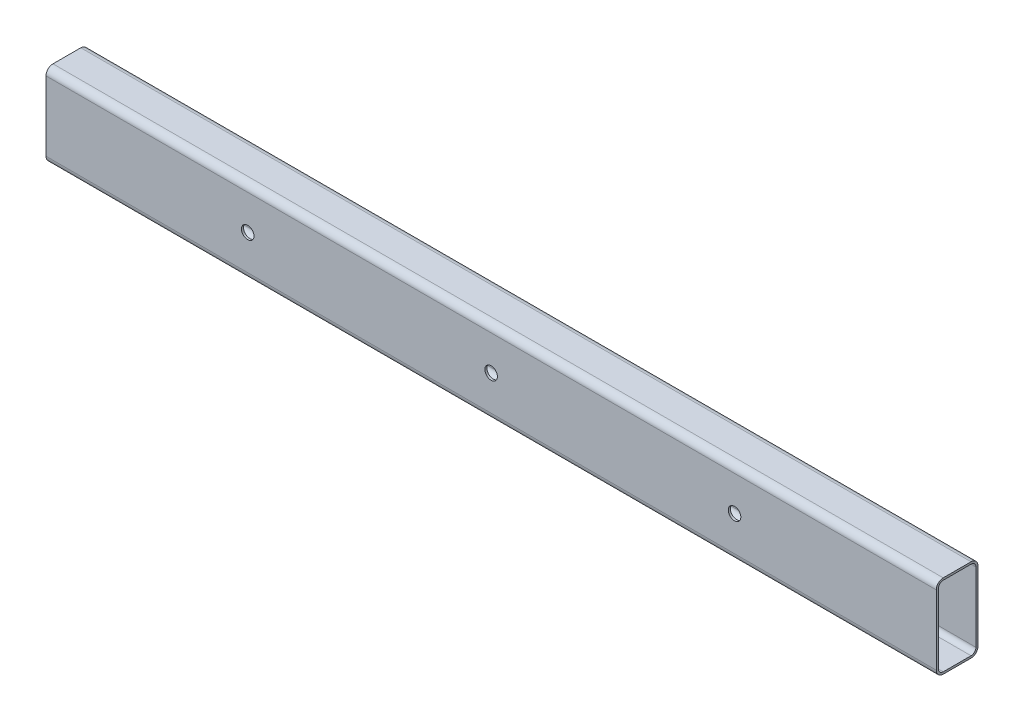
ISO-10303-21;
HEADER;
FILE_DESCRIPTION(('STEP AP214'),'2;1');
FILE_NAME('part.step','',(''),(''),'','','');
FILE_SCHEMA(('AUTOMOTIVE_DESIGN { 1 0 10303 214 1 1 1 1 }'));
ENDSEC;
DATA;
#1=APPLICATION_CONTEXT('core data for automotive mechanical design processes');
#2=APPLICATION_PROTOCOL_DEFINITION('international standard','automotive_design',2000,#1);
#3=PRODUCT_CONTEXT('',#1,'mechanical');
#4=PRODUCT('Part','Part','',(#3));
#5=PRODUCT_RELATED_PRODUCT_CATEGORY('part','',(#4));
#6=PRODUCT_DEFINITION_FORMATION('','',#4);
#7=PRODUCT_DEFINITION_CONTEXT('part definition',#1,'design');
#8=PRODUCT_DEFINITION('design','',#6,#7);
#9=PRODUCT_DEFINITION_SHAPE('','',#8);
#10=(LENGTH_UNIT() NAMED_UNIT(*) SI_UNIT(.MILLI.,.METRE.));
#11=(NAMED_UNIT(*) PLANE_ANGLE_UNIT() SI_UNIT($,.RADIAN.));
#12=(NAMED_UNIT(*) SI_UNIT($,.STERADIAN.) SOLID_ANGLE_UNIT());
#13=UNCERTAINTY_MEASURE_WITH_UNIT(LENGTH_MEASURE(1.E-05),#10,'distance_accuracy_value','');
#14=(GEOMETRIC_REPRESENTATION_CONTEXT(3) GLOBAL_UNCERTAINTY_ASSIGNED_CONTEXT((#13)) GLOBAL_UNIT_ASSIGNED_CONTEXT((#10,
#11,#12)) REPRESENTATION_CONTEXT('',''));
#15=CARTESIAN_POINT('',(0.,0.,0.));
#16=DIRECTION('',(0.,0.,1.));
#17=DIRECTION('',(1.,0.,0.));
#18=AXIS2_PLACEMENT_3D('',#15,#16,#17);
#19=CARTESIAN_POINT('',(-640.,-50.,20.));
#20=DIRECTION('',(1.,0.,0.));
#21=DIRECTION('',(0.,0.,-1.));
#22=AXIS2_PLACEMENT_3D('',#19,#20,#21);
#23=CYLINDRICAL_SURFACE('',#22,10.);
#24=DIRECTION('',(1.,0.,0.));
#25=VECTOR('',#24,1.);
#26=CARTESIAN_POINT('',(-640.,-60.,19.9999999999999));
#27=LINE('',#26,#25);
#28=CARTESIAN_POINT('',(-640.,-60.,19.9999999999999));
#29=VERTEX_POINT('',#28);
#30=CARTESIAN_POINT('',(640.,-60.,19.9999999999999));
#31=VERTEX_POINT('',#30);
#32=EDGE_CURVE('E362',#29,#31,#27,.T.);
#33=ORIENTED_EDGE('',*,*,#32,.T.);
#34=CARTESIAN_POINT('',(640.,-50.,20.));
#35=DIRECTION('',(1.,0.,0.));
#36=DIRECTION('',(0.,0.,1.));
#37=AXIS2_PLACEMENT_3D('',#34,#35,#36);
#38=CIRCLE('',#37,10.);
#39=CARTESIAN_POINT('',(640.,-49.9999999999999,30.));
#40=VERTEX_POINT('',#39);
#41=EDGE_CURVE('E286',#40,#31,#38,.T.);
#42=ORIENTED_EDGE('',*,*,#41,.F.);
#43=DIRECTION('',(1.,0.,0.));
#44=VECTOR('',#43,1.);
#45=CARTESIAN_POINT('',(-640.,-49.9999999999999,30.));
#46=LINE('',#45,#44);
#47=CARTESIAN_POINT('',(-640.,-49.9999999999999,30.));
#48=VERTEX_POINT('',#47);
#49=EDGE_CURVE('E12',#48,#40,#46,.T.);
#50=ORIENTED_EDGE('',*,*,#49,.F.);
#51=CARTESIAN_POINT('',(-640.,-50.,20.));
#52=DIRECTION('',(1.,0.,0.));
#53=DIRECTION('',(0.,0.,1.));
#54=AXIS2_PLACEMENT_3D('',#51,#52,#53);
#55=CIRCLE('',#54,10.);
#56=EDGE_CURVE('E329',#48,#29,#55,.T.);
#57=ORIENTED_EDGE('',*,*,#56,.T.);
#58=EDGE_LOOP('',(#33,#42,#50,#57));
#59=FACE_BOUND('',#58,.T.);
#60=ADVANCED_FACE('F128',(#59),#23,.T.);
#61=CARTESIAN_POINT('',(-640.,-49.9999999999999,30.));
#62=DIRECTION('',(0.,0.,1.));
#63=DIRECTION('',(1.,0.,0.));
#64=AXIS2_PLACEMENT_3D('',#61,#62,#63);
#65=PLANE('',#64);
#66=CARTESIAN_POINT('',(350.,0.,30.));
#67=DIRECTION('',(0.,0.,1.));
#68=DIRECTION('',(-1.,0.,0.));
#69=AXIS2_PLACEMENT_3D('',#66,#67,#68);
#70=CIRCLE('',#69,8.99999999999998);
#71=CARTESIAN_POINT('',(341.,0.,30.));
#72=VERTEX_POINT('',#71);
#73=EDGE_CURVE('E538',#72,#72,#70,.T.);
#74=ORIENTED_EDGE('',*,*,#73,.F.);
#75=EDGE_LOOP('',(#74));
#76=FACE_BOUND('',#75,.T.);
#77=CARTESIAN_POINT('',(-350.,0.,30.));
#78=DIRECTION('',(0.,0.,1.));
#79=DIRECTION('',(1.,0.,0.));
#80=AXIS2_PLACEMENT_3D('',#77,#78,#79);
#81=CIRCLE('',#80,8.99999999999998);
#82=CARTESIAN_POINT('',(-341.,0.,30.));
#83=VERTEX_POINT('',#82);
#84=EDGE_CURVE('E532',#83,#83,#81,.T.);
#85=ORIENTED_EDGE('',*,*,#84,.F.);
#86=EDGE_LOOP('',(#85));
#87=FACE_BOUND('',#86,.T.);
#88=CARTESIAN_POINT('',(0.,0.,30.));
#89=DIRECTION('',(0.,0.,1.));
#90=DIRECTION('',(1.,0.,0.));
#91=AXIS2_PLACEMENT_3D('',#88,#89,#90);
#92=CIRCLE('',#91,9.);
#93=CARTESIAN_POINT('',(9.,0.,30.));
#94=VERTEX_POINT('',#93);
#95=EDGE_CURVE('E527',#94,#94,#92,.T.);
#96=ORIENTED_EDGE('',*,*,#95,.F.);
#97=EDGE_LOOP('',(#96));
#98=FACE_BOUND('',#97,.T.);
#99=ORIENTED_EDGE('',*,*,#49,.T.);
#100=DIRECTION('',(0.,-1.,0.));
#101=VECTOR('',#100,1.);
#102=CARTESIAN_POINT('',(640.,-49.9999999999999,30.));
#103=LINE('',#102,#101);
#104=CARTESIAN_POINT('',(640.,49.9999999999999,30.));
#105=VERTEX_POINT('',#104);
#106=EDGE_CURVE('E307',#105,#40,#103,.T.);
#107=ORIENTED_EDGE('',*,*,#106,.F.);
#108=DIRECTION('',(1.,0.,0.));
#109=VECTOR('',#108,1.);
#110=CARTESIAN_POINT('',(-640.,49.9999999999999,30.));
#111=LINE('',#110,#109);
#112=CARTESIAN_POINT('',(-640.,49.9999999999999,30.));
#113=VERTEX_POINT('',#112);
#114=EDGE_CURVE('E136',#113,#105,#111,.T.);
#115=ORIENTED_EDGE('',*,*,#114,.F.);
#116=DIRECTION('',(0.,-1.,0.));
#117=VECTOR('',#116,1.);
#118=CARTESIAN_POINT('',(-640.,-49.9999999999999,30.));
#119=LINE('',#118,#117);
#120=EDGE_CURVE('E360',#113,#48,#119,.T.);
#121=ORIENTED_EDGE('',*,*,#120,.T.);
#122=EDGE_LOOP('',(#99,#107,#115,#121));
#123=FACE_BOUND('',#122,.T.);
#124=ADVANCED_FACE('F422',(#76,#87,#98,#123),#65,.T.);
#125=CARTESIAN_POINT('',(-640.,50.,20.));
#126=DIRECTION('',(1.,0.,0.));
#127=DIRECTION('',(0.,0.,-1.));
#128=AXIS2_PLACEMENT_3D('',#125,#126,#127);
#129=CYLINDRICAL_SURFACE('',#128,10.);
#130=ORIENTED_EDGE('',*,*,#114,.T.);
#131=CARTESIAN_POINT('',(640.,50.,20.));
#132=DIRECTION('',(1.,0.,0.));
#133=DIRECTION('',(0.,0.,-1.));
#134=AXIS2_PLACEMENT_3D('',#131,#132,#133);
#135=CIRCLE('',#134,10.);
#136=CARTESIAN_POINT('',(640.,60.,19.9999999999999));
#137=VERTEX_POINT('',#136);
#138=EDGE_CURVE('E304',#137,#105,#135,.T.);
#139=ORIENTED_EDGE('',*,*,#138,.F.);
#140=DIRECTION('',(1.,0.,0.));
#141=VECTOR('',#140,1.);
#142=CARTESIAN_POINT('',(-640.,60.,19.9999999999999));
#143=LINE('',#142,#141);
#144=CARTESIAN_POINT('',(-640.,60.,19.9999999999999));
#145=VERTEX_POINT('',#144);
#146=EDGE_CURVE('E365',#145,#137,#143,.T.);
#147=ORIENTED_EDGE('',*,*,#146,.F.);
#148=CARTESIAN_POINT('',(-640.,50.,20.));
#149=DIRECTION('',(1.,0.,0.));
#150=DIRECTION('',(0.,0.,-1.));
#151=AXIS2_PLACEMENT_3D('',#148,#149,#150);
#152=CIRCLE('',#151,10.);
#153=EDGE_CURVE('E357',#145,#113,#152,.T.);
#154=ORIENTED_EDGE('',*,*,#153,.T.);
#155=EDGE_LOOP('',(#130,#139,#147,#154));
#156=FACE_BOUND('',#155,.T.);
#157=ADVANCED_FACE('F426',(#156),#129,.T.);
#158=CARTESIAN_POINT('',(-640.,60.,19.9999999999999));
#159=DIRECTION('',(0.,1.,0.));
#160=DIRECTION('',(0.,0.,1.));
#161=AXIS2_PLACEMENT_3D('',#158,#159,#160);
#162=PLANE('',#161);
#163=ORIENTED_EDGE('',*,*,#146,.T.);
#164=DIRECTION('',(0.,0.,1.));
#165=VECTOR('',#164,1.);
#166=CARTESIAN_POINT('',(640.,60.,19.9999999999999));
#167=LINE('',#166,#165);
#168=CARTESIAN_POINT('',(640.,60.,-19.9999999999999));
#169=VERTEX_POINT('',#168);
#170=EDGE_CURVE('E301',#169,#137,#167,.T.);
#171=ORIENTED_EDGE('',*,*,#170,.F.);
#172=DIRECTION('',(1.,0.,0.));
#173=VECTOR('',#172,1.);
#174=CARTESIAN_POINT('',(-640.,60.,-19.9999999999999));
#175=LINE('',#174,#173);
#176=CARTESIAN_POINT('',(-640.,60.,-19.9999999999999));
#177=VERTEX_POINT('',#176);
#178=EDGE_CURVE('E367',#177,#169,#175,.T.);
#179=ORIENTED_EDGE('',*,*,#178,.F.);
#180=DIRECTION('',(0.,0.,1.));
#181=VECTOR('',#180,1.);
#182=CARTESIAN_POINT('',(-640.,60.,19.9999999999999));
#183=LINE('',#182,#181);
#184=EDGE_CURVE('E354',#177,#145,#183,.T.);
#185=ORIENTED_EDGE('',*,*,#184,.T.);
#186=EDGE_LOOP('',(#163,#171,#179,#185));
#187=FACE_BOUND('',#186,.T.);
#188=ADVANCED_FACE('F455',(#187),#162,.T.);
#189=CARTESIAN_POINT('',(-640.,50.,-20.));
#190=DIRECTION('',(1.,0.,0.));
#191=DIRECTION('',(0.,0.,-1.));
#192=AXIS2_PLACEMENT_3D('',#189,#190,#191);
#193=CYLINDRICAL_SURFACE('',#192,10.);
#194=ORIENTED_EDGE('',*,*,#178,.T.);
#195=CARTESIAN_POINT('',(640.,50.,-20.));
#196=DIRECTION('',(1.,0.,0.));
#197=DIRECTION('',(0.,0.,-1.));
#198=AXIS2_PLACEMENT_3D('',#195,#196,#197);
#199=CIRCLE('',#198,10.);
#200=CARTESIAN_POINT('',(640.,49.9999999999999,-30.));
#201=VERTEX_POINT('',#200);
#202=EDGE_CURVE('E298',#201,#169,#199,.T.);
#203=ORIENTED_EDGE('',*,*,#202,.F.);
#204=DIRECTION('',(1.,0.,0.));
#205=VECTOR('',#204,1.);
#206=CARTESIAN_POINT('',(-640.,49.9999999999999,-30.));
#207=LINE('',#206,#205);
#208=CARTESIAN_POINT('',(-640.,49.9999999999999,-30.));
#209=VERTEX_POINT('',#208);
#210=EDGE_CURVE('E369',#209,#201,#207,.T.);
#211=ORIENTED_EDGE('',*,*,#210,.F.);
#212=CARTESIAN_POINT('',(-640.,50.,-20.));
#213=DIRECTION('',(1.,0.,0.));
#214=DIRECTION('',(0.,0.,-1.));
#215=AXIS2_PLACEMENT_3D('',#212,#213,#214);
#216=CIRCLE('',#215,10.);
#217=EDGE_CURVE('E351',#209,#177,#216,.T.);
#218=ORIENTED_EDGE('',*,*,#217,.T.);
#219=EDGE_LOOP('',(#194,#203,#211,#218));
#220=FACE_BOUND('',#219,.T.);
#221=ADVANCED_FACE('F453',(#220),#193,.T.);
#222=CARTESIAN_POINT('',(-640.,-49.9999999999999,-30.));
#223=DIRECTION('',(0.,0.,-1.));
#224=DIRECTION('',(-1.,0.,0.));
#225=AXIS2_PLACEMENT_3D('',#222,#223,#224);
#226=PLANE('',#225);
#227=CARTESIAN_POINT('',(350.,0.,-30.));
#228=DIRECTION('',(0.,0.,1.));
#229=DIRECTION('',(-1.,0.,0.));
#230=AXIS2_PLACEMENT_3D('',#227,#228,#229);
#231=CIRCLE('',#230,8.99999999999998);
#232=CARTESIAN_POINT('',(341.,0.,-30.));
#233=VERTEX_POINT('',#232);
#234=EDGE_CURVE('E535',#233,#233,#231,.T.);
#235=ORIENTED_EDGE('',*,*,#234,.T.);
#236=EDGE_LOOP('',(#235));
#237=FACE_BOUND('',#236,.T.);
#238=CARTESIAN_POINT('',(-350.,0.,-30.));
#239=DIRECTION('',(0.,0.,1.));
#240=DIRECTION('',(1.,0.,0.));
#241=AXIS2_PLACEMENT_3D('',#238,#239,#240);
#242=CIRCLE('',#241,8.99999999999998);
#243=CARTESIAN_POINT('',(-341.,0.,-30.));
#244=VERTEX_POINT('',#243);
#245=EDGE_CURVE('E529',#244,#244,#242,.T.);
#246=ORIENTED_EDGE('',*,*,#245,.T.);
#247=EDGE_LOOP('',(#246));
#248=FACE_BOUND('',#247,.T.);
#249=CARTESIAN_POINT('',(0.,0.,-30.));
#250=DIRECTION('',(0.,0.,1.));
#251=DIRECTION('',(1.,0.,0.));
#252=AXIS2_PLACEMENT_3D('',#249,#250,#251);
#253=CIRCLE('',#252,9.);
#254=CARTESIAN_POINT('',(9.,0.,-30.));
#255=VERTEX_POINT('',#254);
#256=EDGE_CURVE('E379',#255,#255,#253,.T.);
#257=ORIENTED_EDGE('',*,*,#256,.T.);
#258=EDGE_LOOP('',(#257));
#259=FACE_BOUND('',#258,.T.);
#260=ORIENTED_EDGE('',*,*,#210,.T.);
#261=DIRECTION('',(0.,1.,0.));
#262=VECTOR('',#261,1.);
#263=CARTESIAN_POINT('',(640.,-49.9999999999999,-30.));
#264=LINE('',#263,#262);
#265=CARTESIAN_POINT('',(640.,-50.,-30.));
#266=VERTEX_POINT('',#265);
#267=EDGE_CURVE('E295',#266,#201,#264,.T.);
#268=ORIENTED_EDGE('',*,*,#267,.F.);
#269=DIRECTION('',(1.,0.,0.));
#270=VECTOR('',#269,1.);
#271=CARTESIAN_POINT('',(-640.,-50.,-30.));
#272=LINE('',#271,#270);
#273=CARTESIAN_POINT('',(-640.,-50.,-30.));
#274=VERTEX_POINT('',#273);
#275=EDGE_CURVE('E371',#274,#266,#272,.T.);
#276=ORIENTED_EDGE('',*,*,#275,.F.);
#277=DIRECTION('',(0.,1.,0.));
#278=VECTOR('',#277,1.);
#279=CARTESIAN_POINT('',(-640.,-49.9999999999999,-30.));
#280=LINE('',#279,#278);
#281=EDGE_CURVE('E348',#274,#209,#280,.T.);
#282=ORIENTED_EDGE('',*,*,#281,.T.);
#283=EDGE_LOOP('',(#260,#268,#276,#282));
#284=FACE_BOUND('',#283,.T.);
#285=ADVANCED_FACE('F451',(#237,#248,#259,#284),#226,.T.);
#286=CARTESIAN_POINT('',(-640.,-50.,-20.));
#287=DIRECTION('',(1.,0.,0.));
#288=DIRECTION('',(0.,0.,-1.));
#289=AXIS2_PLACEMENT_3D('',#286,#287,#288);
#290=CYLINDRICAL_SURFACE('',#289,10.);
#291=ORIENTED_EDGE('',*,*,#275,.T.);
#292=CARTESIAN_POINT('',(640.,-50.,-20.));
#293=DIRECTION('',(1.,0.,0.));
#294=DIRECTION('',(0.,0.,-1.));
#295=AXIS2_PLACEMENT_3D('',#292,#293,#294);
#296=CIRCLE('',#295,10.);
#297=CARTESIAN_POINT('',(640.,-60.,-19.9999999999999));
#298=VERTEX_POINT('',#297);
#299=EDGE_CURVE('E292',#298,#266,#296,.T.);
#300=ORIENTED_EDGE('',*,*,#299,.F.);
#301=DIRECTION('',(1.,0.,0.));
#302=VECTOR('',#301,1.);
#303=CARTESIAN_POINT('',(-640.,-60.,-19.9999999999999));
#304=LINE('',#303,#302);
#305=CARTESIAN_POINT('',(-640.,-60.,-19.9999999999999));
#306=VERTEX_POINT('',#305);
#307=EDGE_CURVE('E373',#306,#298,#304,.T.);
#308=ORIENTED_EDGE('',*,*,#307,.F.);
#309=CARTESIAN_POINT('',(-640.,-50.,-20.));
#310=DIRECTION('',(1.,0.,0.));
#311=DIRECTION('',(0.,0.,-1.));
#312=AXIS2_PLACEMENT_3D('',#309,#310,#311);
#313=CIRCLE('',#312,10.);
#314=EDGE_CURVE('E345',#306,#274,#313,.T.);
#315=ORIENTED_EDGE('',*,*,#314,.T.);
#316=EDGE_LOOP('',(#291,#300,#308,#315));
#317=FACE_BOUND('',#316,.T.);
#318=ADVANCED_FACE('F447',(#317),#290,.T.);
#319=CARTESIAN_POINT('',(-640.,-60.,19.9999999999999));
#320=DIRECTION('',(0.,-1.,0.));
#321=DIRECTION('',(0.,0.,-1.));
#322=AXIS2_PLACEMENT_3D('',#319,#320,#321);
#323=PLANE('',#322);
#324=ORIENTED_EDGE('',*,*,#307,.T.);
#325=DIRECTION('',(0.,0.,-1.));
#326=VECTOR('',#325,1.);
#327=CARTESIAN_POINT('',(640.,-60.,19.9999999999999));
#328=LINE('',#327,#326);
#329=EDGE_CURVE('E289',#31,#298,#328,.T.);
#330=ORIENTED_EDGE('',*,*,#329,.F.);
#331=ORIENTED_EDGE('',*,*,#32,.F.);
#332=DIRECTION('',(0.,0.,-1.));
#333=VECTOR('',#332,1.);
#334=CARTESIAN_POINT('',(-640.,-60.,19.9999999999999));
#335=LINE('',#334,#333);
#336=EDGE_CURVE('E342',#29,#306,#335,.T.);
#337=ORIENTED_EDGE('',*,*,#336,.T.);
#338=EDGE_LOOP('',(#324,#330,#331,#337));
#339=FACE_BOUND('',#338,.T.);
#340=ADVANCED_FACE('F432',(#339),#323,.T.);
#341=CARTESIAN_POINT('',(-640.,-50.,20.));
#342=DIRECTION('',(1.,0.,0.));
#343=DIRECTION('',(0.,0.,-1.));
#344=AXIS2_PLACEMENT_3D('',#341,#342,#343);
#345=PLANE('',#344);
#346=DIRECTION('',(0.,-1.,0.));
#347=VECTOR('',#346,1.);
#348=CARTESIAN_POINT('',(-640.,-50.,27.));
#349=LINE('',#348,#347);
#350=CARTESIAN_POINT('',(-640.,49.9999999999999,27.));
#351=VERTEX_POINT('',#350);
#352=CARTESIAN_POINT('',(-640.,-49.9999999999999,27.));
#353=VERTEX_POINT('',#352);
#354=EDGE_CURVE('E253',#351,#353,#349,.T.);
#355=ORIENTED_EDGE('',*,*,#354,.T.);
#356=CARTESIAN_POINT('',(-640.,-50.,20.));
#357=DIRECTION('',(-1.,0.,0.));
#358=DIRECTION('',(0.,0.,1.));
#359=AXIS2_PLACEMENT_3D('',#356,#357,#358);
#360=CIRCLE('',#359,7.);
#361=CARTESIAN_POINT('',(-640.,-57.,19.9999999999999));
#362=VERTEX_POINT('',#361);
#363=EDGE_CURVE('E310',#353,#362,#360,.F.);
#364=ORIENTED_EDGE('',*,*,#363,.T.);
#365=DIRECTION('',(0.,0.,-1.));
#366=VECTOR('',#365,1.);
#367=CARTESIAN_POINT('',(-640.,-57.,20.));
#368=LINE('',#367,#366);
#369=CARTESIAN_POINT('',(-640.,-57.,-19.9999999999999));
#370=VERTEX_POINT('',#369);
#371=EDGE_CURVE('E248',#362,#370,#368,.T.);
#372=ORIENTED_EDGE('',*,*,#371,.T.);
#373=CARTESIAN_POINT('',(-640.,-50.,-20.));
#374=DIRECTION('',(-1.,0.,0.));
#375=DIRECTION('',(0.,0.,1.));
#376=AXIS2_PLACEMENT_3D('',#373,#374,#375);
#377=CIRCLE('',#376,7.);
#378=CARTESIAN_POINT('',(-640.,-50.,-27.));
#379=VERTEX_POINT('',#378);
#380=EDGE_CURVE('E144',#370,#379,#377,.F.);
#381=ORIENTED_EDGE('',*,*,#380,.T.);
#382=DIRECTION('',(0.,1.,0.));
#383=VECTOR('',#382,1.);
#384=CARTESIAN_POINT('',(-640.,-50.,-27.));
#385=LINE('',#384,#383);
#386=CARTESIAN_POINT('',(-640.,49.9999999999999,-27.));
#387=VERTEX_POINT('',#386);
#388=EDGE_CURVE('E314',#379,#387,#385,.T.);
#389=ORIENTED_EDGE('',*,*,#388,.T.);
#390=CARTESIAN_POINT('',(-640.,50.,-20.));
#391=DIRECTION('',(-1.,0.,0.));
#392=DIRECTION('',(0.,0.,1.));
#393=AXIS2_PLACEMENT_3D('',#390,#391,#392);
#394=CIRCLE('',#393,7.);
#395=CARTESIAN_POINT('',(-640.,57.,-20.));
#396=VERTEX_POINT('',#395);
#397=EDGE_CURVE('E317',#387,#396,#394,.F.);
#398=ORIENTED_EDGE('',*,*,#397,.T.);
#399=DIRECTION('',(0.,0.,1.));
#400=VECTOR('',#399,1.);
#401=CARTESIAN_POINT('',(-640.,57.,20.));
#402=LINE('',#401,#400);
#403=CARTESIAN_POINT('',(-640.,57.,19.9999999999999));
#404=VERTEX_POINT('',#403);
#405=EDGE_CURVE('E320',#396,#404,#402,.T.);
#406=ORIENTED_EDGE('',*,*,#405,.T.);
#407=CARTESIAN_POINT('',(-640.,50.,20.));
#408=DIRECTION('',(-1.,0.,0.));
#409=DIRECTION('',(0.,0.,1.));
#410=AXIS2_PLACEMENT_3D('',#407,#408,#409);
#411=CIRCLE('',#410,7.);
#412=EDGE_CURVE('E323',#404,#351,#411,.F.);
#413=ORIENTED_EDGE('',*,*,#412,.T.);
#414=EDGE_LOOP('',(#355,#364,#372,#381,#389,#398,#406,#413));
#415=FACE_BOUND('',#414,.T.);
#416=ORIENTED_EDGE('',*,*,#56,.F.);
#417=ORIENTED_EDGE('',*,*,#120,.F.);
#418=ORIENTED_EDGE('',*,*,#153,.F.);
#419=ORIENTED_EDGE('',*,*,#184,.F.);
#420=ORIENTED_EDGE('',*,*,#217,.F.);
#421=ORIENTED_EDGE('',*,*,#281,.F.);
#422=ORIENTED_EDGE('',*,*,#314,.F.);
#423=ORIENTED_EDGE('',*,*,#336,.F.);
#424=EDGE_LOOP('',(#416,#417,#418,#419,#420,#421,#422,#423));
#425=FACE_BOUND('',#424,.T.);
#426=ADVANCED_FACE('F441',(#415,#425),#345,.F.);
#427=CARTESIAN_POINT('',(-640.,-50.,20.));
#428=DIRECTION('',(1.,0.,0.));
#429=DIRECTION('',(0.,0.,-1.));
#430=AXIS2_PLACEMENT_3D('',#427,#428,#429);
#431=CYLINDRICAL_SURFACE('',#430,7.);
#432=DIRECTION('',(1.,0.,0.));
#433=VECTOR('',#432,1.);
#434=CARTESIAN_POINT('',(-640.,-49.9999999999999,27.));
#435=LINE('',#434,#433);
#436=CARTESIAN_POINT('',(640.,-49.9999999999999,27.));
#437=VERTEX_POINT('',#436);
#438=EDGE_CURVE('E258',#353,#437,#435,.T.);
#439=ORIENTED_EDGE('',*,*,#438,.T.);
#440=CARTESIAN_POINT('',(640.,-50.,20.));
#441=DIRECTION('',(-1.,0.,0.));
#442=DIRECTION('',(0.,0.,1.));
#443=AXIS2_PLACEMENT_3D('',#440,#441,#442);
#444=CIRCLE('',#443,7.);
#445=CARTESIAN_POINT('',(640.,-57.,19.9999999999999));
#446=VERTEX_POINT('',#445);
#447=EDGE_CURVE('E256',#437,#446,#444,.F.);
#448=ORIENTED_EDGE('',*,*,#447,.T.);
#449=DIRECTION('',(1.,0.,0.));
#450=VECTOR('',#449,1.);
#451=CARTESIAN_POINT('',(-640.,-57.,19.9999999999999));
#452=LINE('',#451,#450);
#453=EDGE_CURVE('E241',#362,#446,#452,.T.);
#454=ORIENTED_EDGE('',*,*,#453,.F.);
#455=ORIENTED_EDGE('',*,*,#363,.F.);
#456=EDGE_LOOP('',(#439,#448,#454,#455));
#457=FACE_BOUND('',#456,.T.);
#458=ADVANCED_FACE('F257',(#457),#431,.F.);
#459=CARTESIAN_POINT('',(-640.,-50.,27.));
#460=DIRECTION('',(0.,0.,1.));
#461=DIRECTION('',(1.,0.,0.));
#462=AXIS2_PLACEMENT_3D('',#459,#460,#461);
#463=PLANE('',#462);
#464=CARTESIAN_POINT('',(350.,0.,27.));
#465=DIRECTION('',(0.,0.,1.));
#466=DIRECTION('',(1.,0.,0.));
#467=AXIS2_PLACEMENT_3D('',#464,#465,#466);
#468=CIRCLE('',#467,8.99999999999998);
#469=CARTESIAN_POINT('',(359.,0.,27.));
#470=VERTEX_POINT('',#469);
#471=EDGE_CURVE('E262',#470,#470,#468,.T.);
#472=ORIENTED_EDGE('',*,*,#471,.T.);
#473=EDGE_LOOP('',(#472));
#474=FACE_BOUND('',#473,.T.);
#475=CARTESIAN_POINT('',(-350.,0.,27.));
#476=DIRECTION('',(0.,0.,1.));
#477=DIRECTION('',(1.,0.,0.));
#478=AXIS2_PLACEMENT_3D('',#475,#476,#477);
#479=CIRCLE('',#478,8.99999999999998);
#480=CARTESIAN_POINT('',(-341.,0.,27.));
#481=VERTEX_POINT('',#480);
#482=EDGE_CURVE('E382',#481,#481,#479,.T.);
#483=ORIENTED_EDGE('',*,*,#482,.T.);
#484=EDGE_LOOP('',(#483));
#485=FACE_BOUND('',#484,.T.);
#486=CARTESIAN_POINT('',(0.,0.,27.));
#487=DIRECTION('',(0.,0.,1.));
#488=DIRECTION('',(1.,0.,0.));
#489=AXIS2_PLACEMENT_3D('',#486,#487,#488);
#490=CIRCLE('',#489,9.);
#491=CARTESIAN_POINT('',(9.,0.,27.));
#492=VERTEX_POINT('',#491);
#493=EDGE_CURVE('E378',#492,#492,#490,.T.);
#494=ORIENTED_EDGE('',*,*,#493,.T.);
#495=EDGE_LOOP('',(#494));
#496=FACE_BOUND('',#495,.T.);
#497=DIRECTION('',(1.,0.,0.));
#498=VECTOR('',#497,1.);
#499=CARTESIAN_POINT('',(-640.,49.9999999999999,27.));
#500=LINE('',#499,#498);
#501=CARTESIAN_POINT('',(640.,49.9999999999999,27.));
#502=VERTEX_POINT('',#501);
#503=EDGE_CURVE('E330',#351,#502,#500,.T.);
#504=ORIENTED_EDGE('',*,*,#503,.T.);
#505=DIRECTION('',(0.,-1.,0.));
#506=VECTOR('',#505,1.);
#507=CARTESIAN_POINT('',(640.,-50.,27.));
#508=LINE('',#507,#506);
#509=EDGE_CURVE('E284',#502,#437,#508,.T.);
#510=ORIENTED_EDGE('',*,*,#509,.T.);
#511=ORIENTED_EDGE('',*,*,#438,.F.);
#512=ORIENTED_EDGE('',*,*,#354,.F.);
#513=EDGE_LOOP('',(#504,#510,#511,#512));
#514=FACE_BOUND('',#513,.T.);
#515=ADVANCED_FACE('F480',(#474,#485,#496,#514),#463,.F.);
#516=CARTESIAN_POINT('',(-640.,50.,20.));
#517=DIRECTION('',(1.,0.,0.));
#518=DIRECTION('',(0.,0.,-1.));
#519=AXIS2_PLACEMENT_3D('',#516,#517,#518);
#520=CYLINDRICAL_SURFACE('',#519,7.);
#521=DIRECTION('',(1.,0.,0.));
#522=VECTOR('',#521,1.);
#523=CARTESIAN_POINT('',(-640.,57.,19.9999999999999));
#524=LINE('',#523,#522);
#525=CARTESIAN_POINT('',(640.,57.,19.9999999999999));
#526=VERTEX_POINT('',#525);
#527=EDGE_CURVE('E332',#404,#526,#524,.T.);
#528=ORIENTED_EDGE('',*,*,#527,.T.);
#529=CARTESIAN_POINT('',(640.,50.,20.));
#530=DIRECTION('',(-1.,0.,0.));
#531=DIRECTION('',(0.,0.,1.));
#532=AXIS2_PLACEMENT_3D('',#529,#530,#531);
#533=CIRCLE('',#532,7.);
#534=EDGE_CURVE('E281',#526,#502,#533,.F.);
#535=ORIENTED_EDGE('',*,*,#534,.T.);
#536=ORIENTED_EDGE('',*,*,#503,.F.);
#537=ORIENTED_EDGE('',*,*,#412,.F.);
#538=EDGE_LOOP('',(#528,#535,#536,#537));
#539=FACE_BOUND('',#538,.T.);
#540=ADVANCED_FACE('F497',(#539),#520,.F.);
#541=CARTESIAN_POINT('',(-640.,57.,20.));
#542=DIRECTION('',(0.,1.,0.));
#543=DIRECTION('',(0.,0.,1.));
#544=AXIS2_PLACEMENT_3D('',#541,#542,#543);
#545=PLANE('',#544);
#546=DIRECTION('',(1.,0.,0.));
#547=VECTOR('',#546,1.);
#548=CARTESIAN_POINT('',(-640.,57.,-20.));
#549=LINE('',#548,#547);
#550=CARTESIAN_POINT('',(640.,57.,-20.));
#551=VERTEX_POINT('',#550);
#552=EDGE_CURVE('E334',#396,#551,#549,.T.);
#553=ORIENTED_EDGE('',*,*,#552,.T.);
#554=DIRECTION('',(0.,0.,1.));
#555=VECTOR('',#554,1.);
#556=CARTESIAN_POINT('',(640.,57.,20.));
#557=LINE('',#556,#555);
#558=EDGE_CURVE('E278',#551,#526,#557,.T.);
#559=ORIENTED_EDGE('',*,*,#558,.T.);
#560=ORIENTED_EDGE('',*,*,#527,.F.);
#561=ORIENTED_EDGE('',*,*,#405,.F.);
#562=EDGE_LOOP('',(#553,#559,#560,#561));
#563=FACE_BOUND('',#562,.T.);
#564=ADVANCED_FACE('F493',(#563),#545,.F.);
#565=CARTESIAN_POINT('',(-640.,50.,-20.));
#566=DIRECTION('',(1.,0.,0.));
#567=DIRECTION('',(0.,0.,-1.));
#568=AXIS2_PLACEMENT_3D('',#565,#566,#567);
#569=CYLINDRICAL_SURFACE('',#568,7.);
#570=DIRECTION('',(1.,0.,0.));
#571=VECTOR('',#570,1.);
#572=CARTESIAN_POINT('',(-640.,49.9999999999999,-27.));
#573=LINE('',#572,#571);
#574=CARTESIAN_POINT('',(640.,49.9999999999999,-27.));
#575=VERTEX_POINT('',#574);
#576=EDGE_CURVE('E336',#387,#575,#573,.T.);
#577=ORIENTED_EDGE('',*,*,#576,.T.);
#578=CARTESIAN_POINT('',(640.,50.,-20.));
#579=DIRECTION('',(-1.,0.,0.));
#580=DIRECTION('',(0.,0.,1.));
#581=AXIS2_PLACEMENT_3D('',#578,#579,#580);
#582=CIRCLE('',#581,7.);
#583=EDGE_CURVE('E275',#575,#551,#582,.F.);
#584=ORIENTED_EDGE('',*,*,#583,.T.);
#585=ORIENTED_EDGE('',*,*,#552,.F.);
#586=ORIENTED_EDGE('',*,*,#397,.F.);
#587=EDGE_LOOP('',(#577,#584,#585,#586));
#588=FACE_BOUND('',#587,.T.);
#589=ADVANCED_FACE('F490',(#588),#569,.F.);
#590=CARTESIAN_POINT('',(-640.,-50.,-27.));
#591=DIRECTION('',(0.,0.,-1.));
#592=DIRECTION('',(-1.,0.,0.));
#593=AXIS2_PLACEMENT_3D('',#590,#591,#592);
#594=PLANE('',#593);
#595=CARTESIAN_POINT('',(350.,0.,-27.));
#596=DIRECTION('',(0.,0.,-1.));
#597=DIRECTION('',(-1.,0.,0.));
#598=AXIS2_PLACEMENT_3D('',#595,#596,#597);
#599=CIRCLE('',#598,8.99999999999998);
#600=CARTESIAN_POINT('',(341.,0.,-27.));
#601=VERTEX_POINT('',#600);
#602=EDGE_CURVE('E131',#601,#601,#599,.T.);
#603=ORIENTED_EDGE('',*,*,#602,.T.);
#604=EDGE_LOOP('',(#603));
#605=FACE_BOUND('',#604,.T.);
#606=CARTESIAN_POINT('',(-350.,0.,-27.));
#607=DIRECTION('',(0.,0.,-1.));
#608=DIRECTION('',(-1.,0.,0.));
#609=AXIS2_PLACEMENT_3D('',#606,#607,#608);
#610=CIRCLE('',#609,8.99999999999998);
#611=CARTESIAN_POINT('',(-359.,0.,-27.));
#612=VERTEX_POINT('',#611);
#613=EDGE_CURVE('E380',#612,#612,#610,.T.);
#614=ORIENTED_EDGE('',*,*,#613,.T.);
#615=EDGE_LOOP('',(#614));
#616=FACE_BOUND('',#615,.T.);
#617=CARTESIAN_POINT('',(0.,0.,-27.));
#618=DIRECTION('',(0.,0.,-1.));
#619=DIRECTION('',(-1.,0.,0.));
#620=AXIS2_PLACEMENT_3D('',#617,#618,#619);
#621=CIRCLE('',#620,9.);
#622=CARTESIAN_POINT('',(-9.,0.,-27.));
#623=VERTEX_POINT('',#622);
#624=EDGE_CURVE('E376',#623,#623,#621,.T.);
#625=ORIENTED_EDGE('',*,*,#624,.T.);
#626=EDGE_LOOP('',(#625));
#627=FACE_BOUND('',#626,.T.);
#628=DIRECTION('',(1.,0.,0.));
#629=VECTOR('',#628,1.);
#630=CARTESIAN_POINT('',(-640.,-50.,-27.));
#631=LINE('',#630,#629);
#632=CARTESIAN_POINT('',(640.,-50.,-27.));
#633=VERTEX_POINT('',#632);
#634=EDGE_CURVE('E338',#379,#633,#631,.T.);
#635=ORIENTED_EDGE('',*,*,#634,.T.);
#636=DIRECTION('',(0.,1.,0.));
#637=VECTOR('',#636,1.);
#638=CARTESIAN_POINT('',(640.,-50.,-27.));
#639=LINE('',#638,#637);
#640=EDGE_CURVE('E269',#633,#575,#639,.T.);
#641=ORIENTED_EDGE('',*,*,#640,.T.);
#642=ORIENTED_EDGE('',*,*,#576,.F.);
#643=ORIENTED_EDGE('',*,*,#388,.F.);
#644=EDGE_LOOP('',(#635,#641,#642,#643));
#645=FACE_BOUND('',#644,.T.);
#646=ADVANCED_FACE('F399',(#605,#616,#627,#645),#594,.F.);
#647=CARTESIAN_POINT('',(-640.,-50.,-20.));
#648=DIRECTION('',(1.,0.,0.));
#649=DIRECTION('',(0.,0.,-1.));
#650=AXIS2_PLACEMENT_3D('',#647,#648,#649);
#651=CYLINDRICAL_SURFACE('',#650,7.);
#652=DIRECTION('',(1.,0.,0.));
#653=VECTOR('',#652,1.);
#654=CARTESIAN_POINT('',(-640.,-57.,-19.9999999999999));
#655=LINE('',#654,#653);
#656=CARTESIAN_POINT('',(640.,-57.,-19.9999999999999));
#657=VERTEX_POINT('',#656);
#658=EDGE_CURVE('E252',#370,#657,#655,.T.);
#659=ORIENTED_EDGE('',*,*,#658,.T.);
#660=CARTESIAN_POINT('',(640.,-50.,-20.));
#661=DIRECTION('',(-1.,0.,0.));
#662=DIRECTION('',(0.,0.,1.));
#663=AXIS2_PLACEMENT_3D('',#660,#661,#662);
#664=CIRCLE('',#663,7.);
#665=EDGE_CURVE('E267',#657,#633,#664,.F.);
#666=ORIENTED_EDGE('',*,*,#665,.T.);
#667=ORIENTED_EDGE('',*,*,#634,.F.);
#668=ORIENTED_EDGE('',*,*,#380,.F.);
#669=EDGE_LOOP('',(#659,#666,#667,#668));
#670=FACE_BOUND('',#669,.T.);
#671=ADVANCED_FACE('F485',(#670),#651,.F.);
#672=CARTESIAN_POINT('',(-640.,-57.,20.));
#673=DIRECTION('',(0.,-1.,0.));
#674=DIRECTION('',(0.,0.,-1.));
#675=AXIS2_PLACEMENT_3D('',#672,#673,#674);
#676=PLANE('',#675);
#677=ORIENTED_EDGE('',*,*,#453,.T.);
#678=DIRECTION('',(0.,0.,-1.));
#679=VECTOR('',#678,1.);
#680=CARTESIAN_POINT('',(640.,-57.,20.));
#681=LINE('',#680,#679);
#682=EDGE_CURVE('E245',#446,#657,#681,.T.);
#683=ORIENTED_EDGE('',*,*,#682,.T.);
#684=ORIENTED_EDGE('',*,*,#658,.F.);
#685=ORIENTED_EDGE('',*,*,#371,.F.);
#686=EDGE_LOOP('',(#677,#683,#684,#685));
#687=FACE_BOUND('',#686,.T.);
#688=ADVANCED_FACE('F243',(#687),#676,.F.);
#689=CARTESIAN_POINT('',(640.,-50.,20.));
#690=DIRECTION('',(1.,0.,0.));
#691=DIRECTION('',(0.,0.,-1.));
#692=AXIS2_PLACEMENT_3D('',#689,#690,#691);
#693=PLANE('',#692);
#694=ORIENTED_EDGE('',*,*,#41,.T.);
#695=ORIENTED_EDGE('',*,*,#329,.T.);
#696=ORIENTED_EDGE('',*,*,#299,.T.);
#697=ORIENTED_EDGE('',*,*,#267,.T.);
#698=ORIENTED_EDGE('',*,*,#202,.T.);
#699=ORIENTED_EDGE('',*,*,#170,.T.);
#700=ORIENTED_EDGE('',*,*,#138,.T.);
#701=ORIENTED_EDGE('',*,*,#106,.T.);
#702=EDGE_LOOP('',(#694,#695,#696,#697,#698,#699,#700,#701));
#703=FACE_BOUND('',#702,.T.);
#704=ORIENTED_EDGE('',*,*,#682,.F.);
#705=ORIENTED_EDGE('',*,*,#447,.F.);
#706=ORIENTED_EDGE('',*,*,#509,.F.);
#707=ORIENTED_EDGE('',*,*,#534,.F.);
#708=ORIENTED_EDGE('',*,*,#558,.F.);
#709=ORIENTED_EDGE('',*,*,#583,.F.);
#710=ORIENTED_EDGE('',*,*,#640,.F.);
#711=ORIENTED_EDGE('',*,*,#665,.F.);
#712=EDGE_LOOP('',(#704,#705,#706,#707,#708,#709,#710,#711));
#713=FACE_BOUND('',#712,.T.);
#714=ADVANCED_FACE('F264',(#703,#713),#693,.T.);
#715=CARTESIAN_POINT('',(0.,0.,-30.));
#716=DIRECTION('',(0.,0.,1.));
#717=DIRECTION('',(1.,0.,0.));
#718=AXIS2_PLACEMENT_3D('',#715,#716,#717);
#719=CYLINDRICAL_SURFACE('',#718,9.);
#720=ORIENTED_EDGE('',*,*,#256,.F.);
#721=EDGE_LOOP('',(#720));
#722=FACE_BOUND('',#721,.T.);
#723=ORIENTED_EDGE('',*,*,#624,.F.);
#724=EDGE_LOOP('',(#723));
#725=FACE_BOUND('',#724,.T.);
#726=ADVANCED_FACE('F415',(#722,#725),#719,.F.);
#727=CARTESIAN_POINT('',(-350.,0.,-30.));
#728=DIRECTION('',(0.,0.,1.));
#729=DIRECTION('',(1.,0.,0.));
#730=AXIS2_PLACEMENT_3D('',#727,#728,#729);
#731=CYLINDRICAL_SURFACE('',#730,8.99999999999998);
#732=ORIENTED_EDGE('',*,*,#245,.F.);
#733=EDGE_LOOP('',(#732));
#734=FACE_BOUND('',#733,.T.);
#735=ORIENTED_EDGE('',*,*,#613,.F.);
#736=EDGE_LOOP('',(#735));
#737=FACE_BOUND('',#736,.T.);
#738=ADVANCED_FACE('F404',(#734,#737),#731,.F.);
#739=CARTESIAN_POINT('',(350.,0.,-30.));
#740=DIRECTION('',(0.,0.,1.));
#741=DIRECTION('',(1.,0.,0.));
#742=AXIS2_PLACEMENT_3D('',#739,#740,#741);
#743=CYLINDRICAL_SURFACE('',#742,8.99999999999998);
#744=ORIENTED_EDGE('',*,*,#234,.F.);
#745=EDGE_LOOP('',(#744));
#746=FACE_BOUND('',#745,.T.);
#747=ORIENTED_EDGE('',*,*,#602,.F.);
#748=EDGE_LOOP('',(#747));
#749=FACE_BOUND('',#748,.T.);
#750=ADVANCED_FACE('F401',(#746,#749),#743,.F.);
#751=ORIENTED_EDGE('',*,*,#95,.T.);
#752=EDGE_LOOP('',(#751));
#753=FACE_BOUND('',#752,.T.);
#754=ORIENTED_EDGE('',*,*,#493,.F.);
#755=EDGE_LOOP('',(#754));
#756=FACE_BOUND('',#755,.T.);
#757=ADVANCED_FACE('F403',(#753,#756),#719,.F.);
#758=ORIENTED_EDGE('',*,*,#84,.T.);
#759=EDGE_LOOP('',(#758));
#760=FACE_BOUND('',#759,.T.);
#761=ORIENTED_EDGE('',*,*,#482,.F.);
#762=EDGE_LOOP('',(#761));
#763=FACE_BOUND('',#762,.T.);
#764=ADVANCED_FACE('F412',(#760,#763),#731,.F.);
#765=ORIENTED_EDGE('',*,*,#73,.T.);
#766=EDGE_LOOP('',(#765));
#767=FACE_BOUND('',#766,.T.);
#768=ORIENTED_EDGE('',*,*,#471,.F.);
#769=EDGE_LOOP('',(#768));
#770=FACE_BOUND('',#769,.T.);
#771=ADVANCED_FACE('F407',(#767,#770),#743,.F.);
#772=CLOSED_SHELL('',(#60,#124,#157,#188,#221,#285,#318,#340,#426,#458,#515,#540,#564,#589,#646,
#671,#688,#714,#726,#738,#750,#757,#764,#771));
#773=MANIFOLD_SOLID_BREP('B2',#772);
#774=ADVANCED_BREP_SHAPE_REPRESENTATION('',(#18,#773),#14);
#775=SHAPE_DEFINITION_REPRESENTATION(#9,#774);
ENDSEC;
END-ISO-10303-21;
